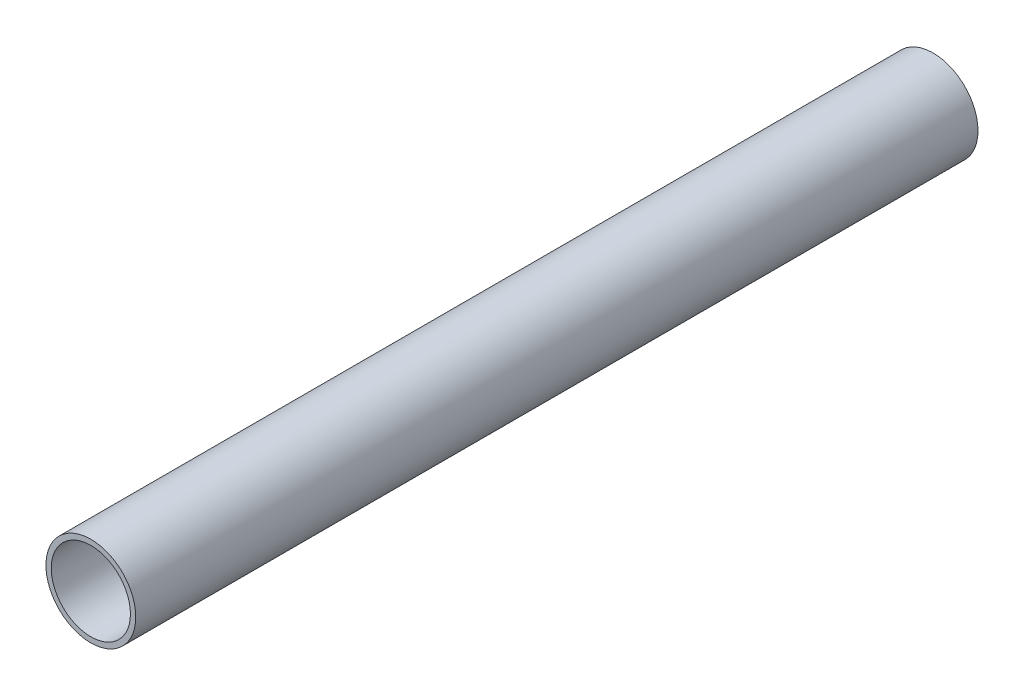
ISO-10303-21;
HEADER;
FILE_DESCRIPTION(('STEP AP214'),'2;1');
FILE_NAME('part.step','',(''),(''),'','','');
FILE_SCHEMA(('AUTOMOTIVE_DESIGN { 1 0 10303 214 1 1 1 1 }'));
ENDSEC;
DATA;
#1=APPLICATION_CONTEXT('core data for automotive mechanical design processes');
#2=APPLICATION_PROTOCOL_DEFINITION('international standard','automotive_design',2000,#1);
#3=PRODUCT_CONTEXT('',#1,'mechanical');
#4=PRODUCT('Part','Part','',(#3));
#5=PRODUCT_RELATED_PRODUCT_CATEGORY('part','',(#4));
#6=PRODUCT_DEFINITION_FORMATION('','',#4);
#7=PRODUCT_DEFINITION_CONTEXT('part definition',#1,'design');
#8=PRODUCT_DEFINITION('design','',#6,#7);
#9=PRODUCT_DEFINITION_SHAPE('','',#8);
#10=(LENGTH_UNIT() NAMED_UNIT(*) SI_UNIT(.MILLI.,.METRE.));
#11=(NAMED_UNIT(*) PLANE_ANGLE_UNIT() SI_UNIT($,.RADIAN.));
#12=(NAMED_UNIT(*) SI_UNIT($,.STERADIAN.) SOLID_ANGLE_UNIT());
#13=UNCERTAINTY_MEASURE_WITH_UNIT(LENGTH_MEASURE(1.E-05),#10,'distance_accuracy_value','');
#14=(GEOMETRIC_REPRESENTATION_CONTEXT(3) GLOBAL_UNCERTAINTY_ASSIGNED_CONTEXT((#13)) GLOBAL_UNIT_ASSIGNED_CONTEXT((#10,
#11,#12)) REPRESENTATION_CONTEXT('',''));
#15=CARTESIAN_POINT('',(0.,0.,0.));
#16=DIRECTION('',(0.,0.,1.));
#17=DIRECTION('',(1.,0.,0.));
#18=AXIS2_PLACEMENT_3D('',#15,#16,#17);
#19=CARTESIAN_POINT('',(0.,0.,300.));
#20=DIRECTION('',(0.,0.,1.));
#21=DIRECTION('',(1.,0.,0.));
#22=AXIS2_PLACEMENT_3D('',#19,#20,#21);
#23=PLANE('',#22);
#24=CARTESIAN_POINT('',(0.,0.,300.));
#25=DIRECTION('',(0.,0.,1.));
#26=DIRECTION('',(1.,0.,0.));
#27=AXIS2_PLACEMENT_3D('',#24,#25,#26);
#28=CIRCLE('',#27,16.);
#29=CARTESIAN_POINT('',(16.,0.,300.));
#30=VERTEX_POINT('',#29);
#31=EDGE_CURVE('E10',#30,#30,#28,.T.);
#32=ORIENTED_EDGE('',*,*,#31,.T.);
#33=EDGE_LOOP('',(#32));
#34=FACE_BOUND('',#33,.T.);
#35=CARTESIAN_POINT('',(0.,0.,300.));
#36=DIRECTION('',(0.,0.,1.));
#37=DIRECTION('',(1.,0.,0.));
#38=AXIS2_PLACEMENT_3D('',#35,#36,#37);
#39=CIRCLE('',#38,14.1);
#40=CARTESIAN_POINT('',(14.1,0.,300.));
#41=VERTEX_POINT('',#40);
#42=EDGE_CURVE('E42',#41,#41,#39,.T.);
#43=ORIENTED_EDGE('',*,*,#42,.F.);
#44=EDGE_LOOP('',(#43));
#45=FACE_BOUND('',#44,.T.);
#46=ADVANCED_FACE('F31',(#34,#45),#23,.T.);
#47=CARTESIAN_POINT('',(0.,0.,0.));
#48=DIRECTION('',(0.,0.,1.));
#49=DIRECTION('',(1.,0.,0.));
#50=AXIS2_PLACEMENT_3D('',#47,#48,#49);
#51=PLANE('',#50);
#52=CARTESIAN_POINT('',(0.,0.,0.));
#53=DIRECTION('',(0.,0.,1.));
#54=DIRECTION('',(1.,0.,0.));
#55=AXIS2_PLACEMENT_3D('',#52,#53,#54);
#56=CIRCLE('',#55,16.);
#57=CARTESIAN_POINT('',(16.,0.,0.));
#58=VERTEX_POINT('',#57);
#59=EDGE_CURVE('E35',#58,#58,#56,.T.);
#60=ORIENTED_EDGE('',*,*,#59,.F.);
#61=EDGE_LOOP('',(#60));
#62=FACE_BOUND('',#61,.T.);
#63=CARTESIAN_POINT('',(0.,0.,0.));
#64=DIRECTION('',(0.,0.,1.));
#65=DIRECTION('',(1.,0.,0.));
#66=AXIS2_PLACEMENT_3D('',#63,#64,#65);
#67=CIRCLE('',#66,14.1);
#68=CARTESIAN_POINT('',(14.1,0.,0.));
#69=VERTEX_POINT('',#68);
#70=EDGE_CURVE('E44',#69,#69,#67,.T.);
#71=ORIENTED_EDGE('',*,*,#70,.T.);
#72=EDGE_LOOP('',(#71));
#73=FACE_BOUND('',#72,.T.);
#74=ADVANCED_FACE('F54',(#62,#73),#51,.F.);
#75=CARTESIAN_POINT('',(0.,0.,300.));
#76=DIRECTION('',(0.,0.,-1.));
#77=DIRECTION('',(-1.,0.,0.));
#78=AXIS2_PLACEMENT_3D('',#75,#76,#77);
#79=CYLINDRICAL_SURFACE('',#78,16.);
#80=ORIENTED_EDGE('',*,*,#31,.F.);
#81=EDGE_LOOP('',(#80));
#82=FACE_BOUND('',#81,.T.);
#83=ORIENTED_EDGE('',*,*,#59,.T.);
#84=EDGE_LOOP('',(#83));
#85=FACE_BOUND('',#84,.T.);
#86=ADVANCED_FACE('F33',(#82,#85),#79,.T.);
#87=CARTESIAN_POINT('',(0.,0.,300.));
#88=DIRECTION('',(0.,0.,-1.));
#89=DIRECTION('',(-1.,0.,0.));
#90=AXIS2_PLACEMENT_3D('',#87,#88,#89);
#91=CYLINDRICAL_SURFACE('',#90,14.1);
#92=ORIENTED_EDGE('',*,*,#42,.T.);
#93=EDGE_LOOP('',(#92));
#94=FACE_BOUND('',#93,.T.);
#95=ORIENTED_EDGE('',*,*,#70,.F.);
#96=EDGE_LOOP('',(#95));
#97=FACE_BOUND('',#96,.T.);
#98=ADVANCED_FACE('F50',(#94,#97),#91,.F.);
#99=CLOSED_SHELL('',(#46,#74,#86,#98));
#100=MANIFOLD_SOLID_BREP('B2',#99);
#101=ADVANCED_BREP_SHAPE_REPRESENTATION('',(#18,#100),#14);
#102=SHAPE_DEFINITION_REPRESENTATION(#9,#101);
ENDSEC;
END-ISO-10303-21;
